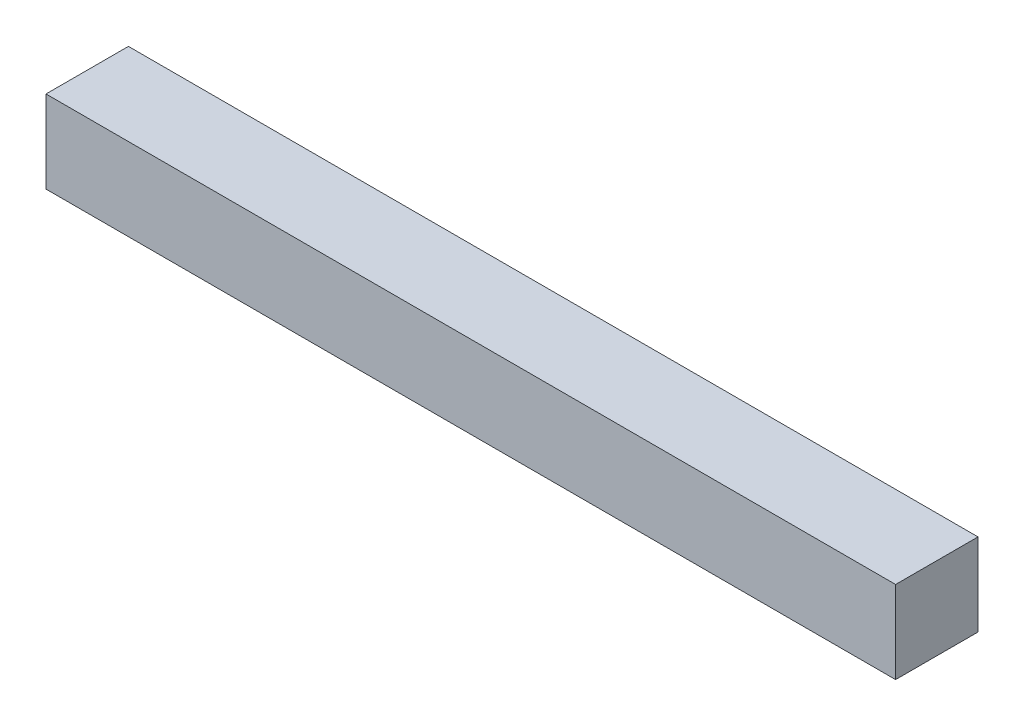
ISO-10303-21;
HEADER;
FILE_DESCRIPTION(('STEP AP214'),'2;1');
FILE_NAME('part.step','',(''),(''),'','','');
FILE_SCHEMA(('AUTOMOTIVE_DESIGN { 1 0 10303 214 1 1 1 1 }'));
ENDSEC;
DATA;
#1=APPLICATION_CONTEXT('core data for automotive mechanical design processes');
#2=APPLICATION_PROTOCOL_DEFINITION('international standard','automotive_design',2000,#1);
#3=PRODUCT_CONTEXT('',#1,'mechanical');
#4=PRODUCT('Part','Part','',(#3));
#5=PRODUCT_RELATED_PRODUCT_CATEGORY('part','',(#4));
#6=PRODUCT_DEFINITION_FORMATION('','',#4);
#7=PRODUCT_DEFINITION_CONTEXT('part definition',#1,'design');
#8=PRODUCT_DEFINITION('design','',#6,#7);
#9=PRODUCT_DEFINITION_SHAPE('','',#8);
#10=(LENGTH_UNIT() NAMED_UNIT(*) SI_UNIT(.MILLI.,.METRE.));
#11=(NAMED_UNIT(*) PLANE_ANGLE_UNIT() SI_UNIT($,.RADIAN.));
#12=(NAMED_UNIT(*) SI_UNIT($,.STERADIAN.) SOLID_ANGLE_UNIT());
#13=UNCERTAINTY_MEASURE_WITH_UNIT(LENGTH_MEASURE(1.E-05),#10,'distance_accuracy_value','');
#14=(GEOMETRIC_REPRESENTATION_CONTEXT(3) GLOBAL_UNCERTAINTY_ASSIGNED_CONTEXT((#13)) GLOBAL_UNIT_ASSIGNED_CONTEXT((#10,
#11,#12)) REPRESENTATION_CONTEXT('',''));
#15=CARTESIAN_POINT('',(0.,0.,0.));
#16=DIRECTION('',(0.,0.,1.));
#17=DIRECTION('',(1.,0.,0.));
#18=AXIS2_PLACEMENT_3D('',#15,#16,#17);
#19=CARTESIAN_POINT('',(-13.5406977113089,6.12813370473538,4.85));
#20=DIRECTION('',(1.,0.,0.));
#21=DIRECTION('',(0.,0.,-1.));
#22=AXIS2_PLACEMENT_3D('',#19,#20,#21);
#23=PLANE('',#22);
#24=DIRECTION('',(0.,-1.,0.));
#25=VECTOR('',#24,1.);
#26=CARTESIAN_POINT('',(-13.5406977113089,6.12813370473538,0.));
#27=LINE('',#26,#25);
#28=CARTESIAN_POINT('',(-13.5406977113089,6.12813370473538,0.));
#29=VERTEX_POINT('',#28);
#30=CARTESIAN_POINT('',(-13.5406977113089,1.27813370473538,0.));
#31=VERTEX_POINT('',#30);
#32=EDGE_CURVE('E96',#29,#31,#27,.T.);
#33=ORIENTED_EDGE('',*,*,#32,.T.);
#34=DIRECTION('',(0.,0.,-1.));
#35=VECTOR('',#34,1.);
#36=CARTESIAN_POINT('',(-13.5406977113089,1.27813370473538,4.85));
#37=LINE('',#36,#35);
#38=CARTESIAN_POINT('',(-13.5406977113089,1.27813370473538,4.85));
#39=VERTEX_POINT('',#38);
#40=EDGE_CURVE('E11',#39,#31,#37,.T.);
#41=ORIENTED_EDGE('',*,*,#40,.F.);
#42=DIRECTION('',(0.,-1.,0.));
#43=VECTOR('',#42,1.);
#44=CARTESIAN_POINT('',(-13.5406977113089,6.12813370473538,4.85));
#45=LINE('',#44,#43);
#46=CARTESIAN_POINT('',(-13.5406977113089,6.12813370473538,4.85));
#47=VERTEX_POINT('',#46);
#48=EDGE_CURVE('E84',#47,#39,#45,.T.);
#49=ORIENTED_EDGE('',*,*,#48,.F.);
#50=DIRECTION('',(0.,0.,-1.));
#51=VECTOR('',#50,1.);
#52=CARTESIAN_POINT('',(-13.5406977113089,6.12813370473538,4.85));
#53=LINE('',#52,#51);
#54=EDGE_CURVE('E92',#47,#29,#53,.T.);
#55=ORIENTED_EDGE('',*,*,#54,.T.);
#56=EDGE_LOOP('',(#33,#41,#49,#55));
#57=FACE_BOUND('',#56,.T.);
#58=ADVANCED_FACE('F33',(#57),#23,.F.);
#59=CARTESIAN_POINT('',(36.4593022886911,1.27813370473538,4.85));
#60=DIRECTION('',(0.,1.,0.));
#61=DIRECTION('',(-1.,0.,0.));
#62=AXIS2_PLACEMENT_3D('',#59,#60,#61);
#63=PLANE('',#62);
#64=DIRECTION('',(1.,0.,0.));
#65=VECTOR('',#64,1.);
#66=CARTESIAN_POINT('',(36.4593022886911,1.27813370473538,0.));
#67=LINE('',#66,#65);
#68=CARTESIAN_POINT('',(36.4593022886911,1.27813370473538,0.));
#69=VERTEX_POINT('',#68);
#70=EDGE_CURVE('E88',#31,#69,#67,.T.);
#71=ORIENTED_EDGE('',*,*,#70,.T.);
#72=DIRECTION('',(0.,0.,-1.));
#73=VECTOR('',#72,1.);
#74=CARTESIAN_POINT('',(36.4593022886911,1.27813370473538,4.85));
#75=LINE('',#74,#73);
#76=CARTESIAN_POINT('',(36.4593022886911,1.27813370473538,4.85));
#77=VERTEX_POINT('',#76);
#78=EDGE_CURVE('E41',#77,#69,#75,.T.);
#79=ORIENTED_EDGE('',*,*,#78,.F.);
#80=DIRECTION('',(1.,0.,0.));
#81=VECTOR('',#80,1.);
#82=CARTESIAN_POINT('',(36.4593022886911,1.27813370473538,4.85));
#83=LINE('',#82,#81);
#84=EDGE_CURVE('E79',#39,#77,#83,.T.);
#85=ORIENTED_EDGE('',*,*,#84,.F.);
#86=ORIENTED_EDGE('',*,*,#40,.T.);
#87=EDGE_LOOP('',(#71,#79,#85,#86));
#88=FACE_BOUND('',#87,.T.);
#89=ADVANCED_FACE('F87',(#88),#63,.F.);
#90=CARTESIAN_POINT('',(36.4593022886911,6.12813370473538,4.85));
#91=DIRECTION('',(-1.,0.,0.));
#92=DIRECTION('',(0.,0.,1.));
#93=AXIS2_PLACEMENT_3D('',#90,#91,#92);
#94=PLANE('',#93);
#95=DIRECTION('',(0.,1.,0.));
#96=VECTOR('',#95,1.);
#97=CARTESIAN_POINT('',(36.4593022886911,6.12813370473538,0.));
#98=LINE('',#97,#96);
#99=CARTESIAN_POINT('',(36.4593022886911,6.12813370473538,0.));
#100=VERTEX_POINT('',#99);
#101=EDGE_CURVE('E66',#69,#100,#98,.T.);
#102=ORIENTED_EDGE('',*,*,#101,.T.);
#103=DIRECTION('',(0.,0.,-1.));
#104=VECTOR('',#103,1.);
#105=CARTESIAN_POINT('',(36.4593022886911,6.12813370473538,4.85));
#106=LINE('',#105,#104);
#107=CARTESIAN_POINT('',(36.4593022886911,6.12813370473538,4.85));
#108=VERTEX_POINT('',#107);
#109=EDGE_CURVE('E89',#108,#100,#106,.T.);
#110=ORIENTED_EDGE('',*,*,#109,.F.);
#111=DIRECTION('',(0.,1.,0.));
#112=VECTOR('',#111,1.);
#113=CARTESIAN_POINT('',(36.4593022886911,6.12813370473538,4.85));
#114=LINE('',#113,#112);
#115=EDGE_CURVE('E82',#77,#108,#114,.T.);
#116=ORIENTED_EDGE('',*,*,#115,.F.);
#117=ORIENTED_EDGE('',*,*,#78,.T.);
#118=EDGE_LOOP('',(#102,#110,#116,#117));
#119=FACE_BOUND('',#118,.T.);
#120=ADVANCED_FACE('F90',(#119),#94,.F.);
#121=CARTESIAN_POINT('',(36.4593022886911,6.12813370473538,4.85));
#122=DIRECTION('',(0.,-1.,0.));
#123=DIRECTION('',(1.,0.,0.));
#124=AXIS2_PLACEMENT_3D('',#121,#122,#123);
#125=PLANE('',#124);
#126=DIRECTION('',(-1.,0.,0.));
#127=VECTOR('',#126,1.);
#128=CARTESIAN_POINT('',(36.4593022886911,6.12813370473538,0.));
#129=LINE('',#128,#127);
#130=EDGE_CURVE('E72',#100,#29,#129,.T.);
#131=ORIENTED_EDGE('',*,*,#130,.T.);
#132=ORIENTED_EDGE('',*,*,#54,.F.);
#133=DIRECTION('',(-1.,0.,0.));
#134=VECTOR('',#133,1.);
#135=CARTESIAN_POINT('',(36.4593022886911,6.12813370473538,4.85));
#136=LINE('',#135,#134);
#137=EDGE_CURVE('E49',#108,#47,#136,.T.);
#138=ORIENTED_EDGE('',*,*,#137,.F.);
#139=ORIENTED_EDGE('',*,*,#109,.T.);
#140=EDGE_LOOP('',(#131,#132,#138,#139));
#141=FACE_BOUND('',#140,.T.);
#142=ADVANCED_FACE('F103',(#141),#125,.F.);
#143=CARTESIAN_POINT('',(0.,0.,4.85));
#144=DIRECTION('',(0.,0.,-1.));
#145=DIRECTION('',(-1.,0.,0.));
#146=AXIS2_PLACEMENT_3D('',#143,#144,#145);
#147=PLANE('',#146);
#148=ORIENTED_EDGE('',*,*,#48,.T.);
#149=ORIENTED_EDGE('',*,*,#84,.T.);
#150=ORIENTED_EDGE('',*,*,#115,.T.);
#151=ORIENTED_EDGE('',*,*,#137,.T.);
#152=EDGE_LOOP('',(#148,#149,#150,#151));
#153=FACE_BOUND('',#152,.T.);
#154=ADVANCED_FACE('F80',(#153),#147,.F.);
#155=CARTESIAN_POINT('',(0.,0.,0.));
#156=DIRECTION('',(0.,0.,-1.));
#157=DIRECTION('',(-1.,0.,0.));
#158=AXIS2_PLACEMENT_3D('',#155,#156,#157);
#159=PLANE('',#158);
#160=ORIENTED_EDGE('',*,*,#32,.F.);
#161=ORIENTED_EDGE('',*,*,#130,.F.);
#162=ORIENTED_EDGE('',*,*,#101,.F.);
#163=ORIENTED_EDGE('',*,*,#70,.F.);
#164=EDGE_LOOP('',(#160,#161,#162,#163));
#165=FACE_BOUND('',#164,.T.);
#166=ADVANCED_FACE('F106',(#165),#159,.T.);
#167=CLOSED_SHELL('',(#58,#89,#120,#142,#154,#166));
#168=MANIFOLD_SOLID_BREP('B2',#167);
#169=ADVANCED_BREP_SHAPE_REPRESENTATION('',(#18,#168),#14);
#170=SHAPE_DEFINITION_REPRESENTATION(#9,#169);
ENDSEC;
END-ISO-10303-21;
